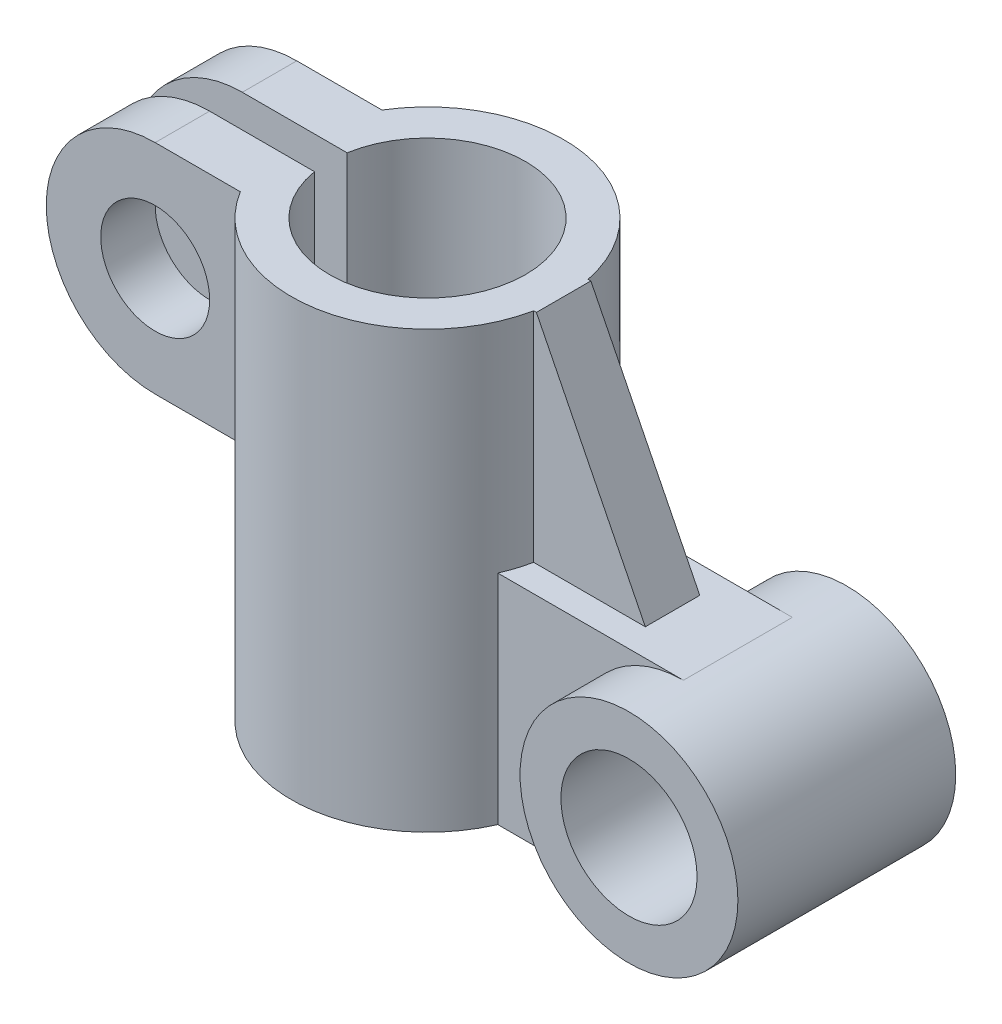
ISO-10303-21;
HEADER;
FILE_DESCRIPTION(('STEP AP214'),'2;1');
FILE_NAME('part.step','',(''),(''),'','','');
FILE_SCHEMA(('AUTOMOTIVE_DESIGN { 1 0 10303 214 1 1 1 1 }'));
ENDSEC;
DATA;
#1=APPLICATION_CONTEXT('core data for automotive mechanical design processes');
#2=APPLICATION_PROTOCOL_DEFINITION('international standard','automotive_design',2000,#1);
#3=PRODUCT_CONTEXT('',#1,'mechanical');
#4=PRODUCT('Part','Part','',(#3));
#5=PRODUCT_RELATED_PRODUCT_CATEGORY('part','',(#4));
#6=PRODUCT_DEFINITION_FORMATION('','',#4);
#7=PRODUCT_DEFINITION_CONTEXT('part definition',#1,'design');
#8=PRODUCT_DEFINITION('design','',#6,#7);
#9=PRODUCT_DEFINITION_SHAPE('','',#8);
#10=(LENGTH_UNIT() NAMED_UNIT(*) SI_UNIT(.MILLI.,.METRE.));
#11=(NAMED_UNIT(*) PLANE_ANGLE_UNIT() SI_UNIT($,.RADIAN.));
#12=(NAMED_UNIT(*) SI_UNIT($,.STERADIAN.) SOLID_ANGLE_UNIT());
#13=UNCERTAINTY_MEASURE_WITH_UNIT(LENGTH_MEASURE(1.E-05),#10,'distance_accuracy_value','');
#14=(GEOMETRIC_REPRESENTATION_CONTEXT(3) GLOBAL_UNCERTAINTY_ASSIGNED_CONTEXT((#13)) GLOBAL_UNIT_ASSIGNED_CONTEXT((#10,
#11,#12)) REPRESENTATION_CONTEXT('',''));
#15=CARTESIAN_POINT('',(0.,0.,0.));
#16=DIRECTION('',(0.,0.,1.));
#17=DIRECTION('',(1.,0.,0.));
#18=AXIS2_PLACEMENT_3D('',#15,#16,#17);
#19=CARTESIAN_POINT('',(0.,80.,0.));
#20=DIRECTION('',(0.,-1.,0.));
#21=DIRECTION('',(0.,0.,-1.));
#22=AXIS2_PLACEMENT_3D('',#19,#20,#21);
#23=CYLINDRICAL_SURFACE('',#22,25.);
#24=CARTESIAN_POINT('',(0.,40.,0.));
#25=DIRECTION('',(0.,1.,0.));
#26=DIRECTION('',(-1.,0.,0.));
#27=AXIS2_PLACEMENT_3D('',#24,#25,#26);
#28=CIRCLE('',#27,25.);
#29=CARTESIAN_POINT('',(-21.3541565040619,40.,13.0000000000012));
#30=VERTEX_POINT('',#29);
#31=CARTESIAN_POINT('',(-24.8193472919817,40.,3.));
#32=VERTEX_POINT('',#31);
#33=EDGE_CURVE('E192',#30,#32,#28,.F.);
#34=ORIENTED_EDGE('',*,*,#33,.T.);
#35=DIRECTION('',(0.,-1.,0.));
#36=VECTOR('',#35,1.);
#37=CARTESIAN_POINT('',(-24.8193472919817,80.,3.));
#38=LINE('',#37,#36);
#39=CARTESIAN_POINT('',(-24.8193472919817,0.,3.));
#40=VERTEX_POINT('',#39);
#41=EDGE_CURVE('E227',#32,#40,#38,.T.);
#42=ORIENTED_EDGE('',*,*,#41,.T.);
#43=CARTESIAN_POINT('',(0.,0.,0.));
#44=DIRECTION('',(0.,1.,0.));
#45=DIRECTION('',(0.,0.,1.));
#46=AXIS2_PLACEMENT_3D('',#43,#44,#45);
#47=CIRCLE('',#46,25.);
#48=CARTESIAN_POINT('',(22.9128784747792,0.,10.));
#49=VERTEX_POINT('',#48);
#50=EDGE_CURVE('E184',#40,#49,#47,.T.);
#51=ORIENTED_EDGE('',*,*,#50,.T.);
#52=DIRECTION('',(0.,-1.,0.));
#53=VECTOR('',#52,1.);
#54=CARTESIAN_POINT('',(22.9128784747792,80.,10.));
#55=LINE('',#54,#53);
#56=CARTESIAN_POINT('',(22.9128784747755,40.,10.0000000000086));
#57=VERTEX_POINT('',#56);
#58=EDGE_CURVE('E283',#49,#57,#55,.F.);
#59=ORIENTED_EDGE('',*,*,#58,.T.);
#60=CARTESIAN_POINT('',(0.,40.,0.));
#61=DIRECTION('',(0.,-1.,0.));
#62=DIRECTION('',(1.,0.,0.));
#63=AXIS2_PLACEMENT_3D('',#60,#61,#62);
#64=CIRCLE('',#63,25.);
#65=CARTESIAN_POINT('',(24.4948974278318,40.,5.));
#66=VERTEX_POINT('',#65);
#67=EDGE_CURVE('E284',#57,#66,#64,.F.);
#68=ORIENTED_EDGE('',*,*,#67,.T.);
#69=DIRECTION('',(0.,-1.,0.));
#70=VECTOR('',#69,1.);
#71=CARTESIAN_POINT('',(24.4948974278318,80.,5.));
#72=LINE('',#71,#70);
#73=CARTESIAN_POINT('',(24.4948974278318,80.,5.));
#74=VERTEX_POINT('',#73);
#75=EDGE_CURVE('E252',#66,#74,#72,.F.);
#76=ORIENTED_EDGE('',*,*,#75,.T.);
#77=CARTESIAN_POINT('',(0.,80.,0.));
#78=DIRECTION('',(0.,1.,0.));
#79=DIRECTION('',(0.,0.,1.));
#80=AXIS2_PLACEMENT_3D('',#77,#78,#79);
#81=CIRCLE('',#80,25.);
#82=CARTESIAN_POINT('',(-21.3541565040626,80.,13.));
#83=VERTEX_POINT('',#82);
#84=EDGE_CURVE('E11',#83,#74,#81,.T.);
#85=ORIENTED_EDGE('',*,*,#84,.F.);
#86=DIRECTION('',(0.,-1.,0.));
#87=VECTOR('',#86,1.);
#88=CARTESIAN_POINT('',(-21.3541565040626,80.,13.));
#89=LINE('',#88,#87);
#90=EDGE_CURVE('E315',#83,#30,#89,.T.);
#91=ORIENTED_EDGE('',*,*,#90,.T.);
#92=EDGE_LOOP('',(#34,#42,#51,#59,#68,#76,#85,#91));
#93=FACE_BOUND('',#92,.T.);
#94=ADVANCED_FACE('F35',(#93),#23,.T.);
#95=CARTESIAN_POINT('',(500000.,40.0000000000434,13.));
#96=DIRECTION('',(0.,1.,0.));
#97=DIRECTION('',(-1.,0.,0.));
#98=AXIS2_PLACEMENT_3D('',#95,#96,#97);
#99=PLANE('',#98);
#100=DIRECTION('',(0.,0.,-1.));
#101=VECTOR('',#100,1.);
#102=CARTESIAN_POINT('',(-37.,40.,13.));
#103=LINE('',#102,#101);
#104=CARTESIAN_POINT('',(-37.,40.,13.));
#105=VERTEX_POINT('',#104);
#106=CARTESIAN_POINT('',(-37.,40.,3.00000000000001));
#107=VERTEX_POINT('',#106);
#108=EDGE_CURVE('E312',#105,#107,#103,.T.);
#109=ORIENTED_EDGE('',*,*,#108,.T.);
#110=DIRECTION('',(1.,0.,0.));
#111=VECTOR('',#110,1.);
#112=CARTESIAN_POINT('',(500000.,40.0000000000434,2.99999999993558));
#113=LINE('',#112,#111);
#114=EDGE_CURVE('E52',#107,#32,#113,.T.);
#115=ORIENTED_EDGE('',*,*,#114,.T.);
#116=ORIENTED_EDGE('',*,*,#33,.F.);
#117=DIRECTION('',(-1.,0.,0.));
#118=VECTOR('',#117,1.);
#119=CARTESIAN_POINT('',(500000.,40.0000000000434,13.));
#120=LINE('',#119,#118);
#121=EDGE_CURVE('E189',#30,#105,#120,.T.);
#122=ORIENTED_EDGE('',*,*,#121,.T.);
#123=EDGE_LOOP('',(#109,#115,#116,#122));
#124=FACE_BOUND('',#123,.T.);
#125=ADVANCED_FACE('F360',(#124),#99,.F.);
#126=CARTESIAN_POINT('',(-37.,60.,13.));
#127=DIRECTION('',(0.,0.,-1.));
#128=DIRECTION('',(-1.,0.,0.));
#129=AXIS2_PLACEMENT_3D('',#126,#127,#128);
#130=CYLINDRICAL_SURFACE('',#129,20.);
#131=DIRECTION('',(0.,0.,-1.));
#132=VECTOR('',#131,1.);
#133=CARTESIAN_POINT('',(-37.,80.,13.));
#134=LINE('',#133,#132);
#135=CARTESIAN_POINT('',(-37.,80.,13.));
#136=VERTEX_POINT('',#135);
#137=CARTESIAN_POINT('',(-37.,80.,3.00000000000001));
#138=VERTEX_POINT('',#137);
#139=EDGE_CURVE('E308',#136,#138,#134,.T.);
#140=ORIENTED_EDGE('',*,*,#139,.T.);
#141=CARTESIAN_POINT('',(-37.,60.,3.00000000000001));
#142=DIRECTION('',(0.,0.,1.));
#143=DIRECTION('',(1.,0.,0.));
#144=AXIS2_PLACEMENT_3D('',#141,#142,#143);
#145=CIRCLE('',#144,20.);
#146=EDGE_CURVE('E224',#138,#107,#145,.T.);
#147=ORIENTED_EDGE('',*,*,#146,.T.);
#148=ORIENTED_EDGE('',*,*,#108,.F.);
#149=CARTESIAN_POINT('',(-37.,60.,13.));
#150=DIRECTION('',(0.,0.,1.));
#151=DIRECTION('',(1.,0.,0.));
#152=AXIS2_PLACEMENT_3D('',#149,#150,#151);
#153=CIRCLE('',#152,20.);
#154=EDGE_CURVE('E298',#136,#105,#153,.T.);
#155=ORIENTED_EDGE('',*,*,#154,.F.);
#156=EDGE_LOOP('',(#140,#147,#148,#155));
#157=FACE_BOUND('',#156,.T.);
#158=ADVANCED_FACE('F362',(#157),#130,.T.);
#159=CARTESIAN_POINT('',(-37.,60.,-25.));
#160=DIRECTION('',(0.,0.,1.));
#161=DIRECTION('',(1.,0.,0.));
#162=AXIS2_PLACEMENT_3D('',#159,#160,#161);
#163=CYLINDRICAL_SURFACE('',#162,10.);
#164=CARTESIAN_POINT('',(-37.,60.,3.00000000000001));
#165=DIRECTION('',(0.,0.,1.));
#166=DIRECTION('',(1.,0.,0.));
#167=AXIS2_PLACEMENT_3D('',#164,#165,#166);
#168=CIRCLE('',#167,10.);
#169=CARTESIAN_POINT('',(-27.,60.,3.));
#170=VERTEX_POINT('',#169);
#171=EDGE_CURVE('E39',#170,#170,#168,.F.);
#172=ORIENTED_EDGE('',*,*,#171,.T.);
#173=EDGE_LOOP('',(#172));
#174=FACE_BOUND('',#173,.T.);
#175=CARTESIAN_POINT('',(-37.,60.,13.));
#176=DIRECTION('',(0.,0.,1.));
#177=DIRECTION('',(1.,0.,0.));
#178=AXIS2_PLACEMENT_3D('',#175,#176,#177);
#179=CIRCLE('',#178,10.);
#180=CARTESIAN_POINT('',(-27.,60.,13.));
#181=VERTEX_POINT('',#180);
#182=EDGE_CURVE('E200',#181,#181,#179,.T.);
#183=ORIENTED_EDGE('',*,*,#182,.T.);
#184=EDGE_LOOP('',(#183));
#185=FACE_BOUND('',#184,.T.);
#186=ADVANCED_FACE('F400',(#174,#185),#163,.F.);
#187=CARTESIAN_POINT('',(22.9128784747792,0.,-10.));
#188=VERTEX_POINT('',#187);
#189=CARTESIAN_POINT('',(-24.8193472919817,0.,-3.));
#190=VERTEX_POINT('',#189);
#191=EDGE_CURVE('E187',#188,#190,#47,.T.);
#192=ORIENTED_EDGE('',*,*,#191,.T.);
#193=DIRECTION('',(0.,-1.,0.));
#194=VECTOR('',#193,1.);
#195=CARTESIAN_POINT('',(-24.8193472919817,80.,-3.));
#196=LINE('',#195,#194);
#197=CARTESIAN_POINT('',(-24.8193472919817,40.,-3.));
#198=VERTEX_POINT('',#197);
#199=EDGE_CURVE('E169',#190,#198,#196,.F.);
#200=ORIENTED_EDGE('',*,*,#199,.T.);
#201=CARTESIAN_POINT('',(-21.35415650406,40.,-13.));
#202=VERTEX_POINT('',#201);
#203=EDGE_CURVE('E317',#198,#202,#28,.F.);
#204=ORIENTED_EDGE('',*,*,#203,.T.);
#205=DIRECTION('',(0.,-1.,0.));
#206=VECTOR('',#205,1.);
#207=CARTESIAN_POINT('',(-21.3541565040626,80.,-13.));
#208=LINE('',#207,#206);
#209=CARTESIAN_POINT('',(-21.3541565040626,80.,-13.));
#210=VERTEX_POINT('',#209);
#211=EDGE_CURVE('E199',#202,#210,#208,.F.);
#212=ORIENTED_EDGE('',*,*,#211,.T.);
#213=CARTESIAN_POINT('',(24.4948974278318,80.,-5.));
#214=VERTEX_POINT('',#213);
#215=EDGE_CURVE('E44',#214,#210,#81,.T.);
#216=ORIENTED_EDGE('',*,*,#215,.F.);
#217=DIRECTION('',(0.,-1.,0.));
#218=VECTOR('',#217,1.);
#219=CARTESIAN_POINT('',(24.4948974278318,80.,-5.));
#220=LINE('',#219,#218);
#221=CARTESIAN_POINT('',(24.4948974278318,40.,-5.));
#222=VERTEX_POINT('',#221);
#223=EDGE_CURVE('E247',#222,#214,#220,.F.);
#224=ORIENTED_EDGE('',*,*,#223,.F.);
#225=CARTESIAN_POINT('',(22.9128784747559,40.,-10.));
#226=VERTEX_POINT('',#225);
#227=EDGE_CURVE('E288',#222,#226,#64,.F.);
#228=ORIENTED_EDGE('',*,*,#227,.T.);
#229=DIRECTION('',(0.,-1.,0.));
#230=VECTOR('',#229,1.);
#231=CARTESIAN_POINT('',(22.9128784747792,80.,-10.));
#232=LINE('',#231,#230);
#233=EDGE_CURVE('E203',#226,#188,#232,.T.);
#234=ORIENTED_EDGE('',*,*,#233,.T.);
#235=EDGE_LOOP('',(#192,#200,#204,#212,#216,#224,#228,#234));
#236=FACE_BOUND('',#235,.T.);
#237=ADVANCED_FACE('F37',(#236),#23,.T.);
#238=CARTESIAN_POINT('',(0.,80.,0.));
#239=DIRECTION('',(0.,1.,0.));
#240=DIRECTION('',(0.,0.,1.));
#241=AXIS2_PLACEMENT_3D('',#238,#239,#240);
#242=PLANE('',#241);
#243=DIRECTION('',(1.,0.,0.));
#244=VECTOR('',#243,1.);
#245=CARTESIAN_POINT('',(-2.78689670523996,80.,3.));
#246=LINE('',#245,#244);
#247=CARTESIAN_POINT('',(-17.7482393492988,80.,3.));
#248=VERTEX_POINT('',#247);
#249=EDGE_CURVE('E179',#138,#248,#246,.T.);
#250=ORIENTED_EDGE('',*,*,#249,.F.);
#251=ORIENTED_EDGE('',*,*,#139,.F.);
#252=DIRECTION('',(-1.,0.,0.));
#253=VECTOR('',#252,1.);
#254=CARTESIAN_POINT('',(500000.,80.0000000000434,13.));
#255=LINE('',#254,#253);
#256=EDGE_CURVE('E318',#83,#136,#255,.T.);
#257=ORIENTED_EDGE('',*,*,#256,.F.);
#258=ORIENTED_EDGE('',*,*,#84,.T.);
#259=DIRECTION('',(1.,0.,0.));
#260=VECTOR('',#259,1.);
#261=CARTESIAN_POINT('',(10.,80.,5.));
#262=LINE('',#261,#260);
#263=CARTESIAN_POINT('',(25.,80.,5.));
#264=VERTEX_POINT('',#263);
#265=EDGE_CURVE('E232',#264,#74,#262,.F.);
#266=ORIENTED_EDGE('',*,*,#265,.F.);
#267=DIRECTION('',(0.,0.,1.));
#268=VECTOR('',#267,1.);
#269=CARTESIAN_POINT('',(25.,80.,0.));
#270=LINE('',#269,#268);
#271=CARTESIAN_POINT('',(25.,80.,-5.));
#272=VERTEX_POINT('',#271);
#273=EDGE_CURVE('E239',#272,#264,#270,.T.);
#274=ORIENTED_EDGE('',*,*,#273,.F.);
#275=DIRECTION('',(1.,0.,0.));
#276=VECTOR('',#275,1.);
#277=CARTESIAN_POINT('',(10.,80.,-5.));
#278=LINE('',#277,#276);
#279=EDGE_CURVE('E231',#272,#214,#278,.F.);
#280=ORIENTED_EDGE('',*,*,#279,.T.);
#281=ORIENTED_EDGE('',*,*,#215,.T.);
#282=DIRECTION('',(-1.,0.,0.));
#283=VECTOR('',#282,1.);
#284=CARTESIAN_POINT('',(0.,80.,-13.));
#285=LINE('',#284,#283);
#286=CARTESIAN_POINT('',(-37.,80.,-13.));
#287=VERTEX_POINT('',#286);
#288=EDGE_CURVE('E301',#210,#287,#285,.T.);
#289=ORIENTED_EDGE('',*,*,#288,.T.);
#290=CARTESIAN_POINT('',(-37.,80.,-2.99999999999998));
#291=VERTEX_POINT('',#290);
#292=EDGE_CURVE('E178',#291,#287,#134,.T.);
#293=ORIENTED_EDGE('',*,*,#292,.F.);
#294=DIRECTION('',(-1.,0.,0.));
#295=VECTOR('',#294,1.);
#296=CARTESIAN_POINT('',(-2.78689670523996,80.,-3.));
#297=LINE('',#296,#295);
#298=CARTESIAN_POINT('',(-17.7482393492988,80.,-3.));
#299=VERTEX_POINT('',#298);
#300=EDGE_CURVE('E60',#299,#291,#297,.T.);
#301=ORIENTED_EDGE('',*,*,#300,.F.);
#302=CARTESIAN_POINT('',(0.,80.,0.));
#303=DIRECTION('',(0.,1.,0.));
#304=DIRECTION('',(0.,0.,1.));
#305=AXIS2_PLACEMENT_3D('',#302,#303,#304);
#306=CIRCLE('',#305,18.);
#307=EDGE_CURVE('E176',#248,#299,#306,.T.);
#308=ORIENTED_EDGE('',*,*,#307,.F.);
#309=EDGE_LOOP('',(#250,#251,#257,#258,#266,#274,#280,#281,#289,#293,#301,#308));
#310=FACE_BOUND('',#309,.T.);
#311=ADVANCED_FACE('F175',(#310),#242,.T.);
#312=CARTESIAN_POINT('',(0.,0.,0.));
#313=DIRECTION('',(0.,1.,0.));
#314=DIRECTION('',(0.,0.,1.));
#315=AXIS2_PLACEMENT_3D('',#312,#313,#314);
#316=PLANE('',#315);
#317=ORIENTED_EDGE('',*,*,#50,.F.);
#318=DIRECTION('',(1.,0.,0.));
#319=VECTOR('',#318,1.);
#320=CARTESIAN_POINT('',(-2.78689670523996,0.,3.));
#321=LINE('',#320,#319);
#322=CARTESIAN_POINT('',(-17.7482393492988,0.,3.));
#323=VERTEX_POINT('',#322);
#324=EDGE_CURVE('E208',#40,#323,#321,.T.);
#325=ORIENTED_EDGE('',*,*,#324,.T.);
#326=CARTESIAN_POINT('',(0.,0.,0.));
#327=DIRECTION('',(0.,1.,0.));
#328=DIRECTION('',(0.,0.,1.));
#329=AXIS2_PLACEMENT_3D('',#326,#327,#328);
#330=CIRCLE('',#329,18.);
#331=CARTESIAN_POINT('',(-17.7482393492988,0.,-3.));
#332=VERTEX_POINT('',#331);
#333=EDGE_CURVE('E185',#323,#332,#330,.T.);
#334=ORIENTED_EDGE('',*,*,#333,.T.);
#335=DIRECTION('',(-1.,0.,0.));
#336=VECTOR('',#335,1.);
#337=CARTESIAN_POINT('',(-2.78689670523996,0.,-3.));
#338=LINE('',#337,#336);
#339=EDGE_CURVE('E164',#332,#190,#338,.T.);
#340=ORIENTED_EDGE('',*,*,#339,.T.);
#341=ORIENTED_EDGE('',*,*,#191,.F.);
#342=DIRECTION('',(1.,0.,0.));
#343=VECTOR('',#342,1.);
#344=CARTESIAN_POINT('',(0.,0.,-10.));
#345=LINE('',#344,#343);
#346=CARTESIAN_POINT('',(57.,0.,-10.));
#347=VERTEX_POINT('',#346);
#348=EDGE_CURVE('E271',#188,#347,#345,.T.);
#349=ORIENTED_EDGE('',*,*,#348,.T.);
#350=DIRECTION('',(0.,0.,-1.));
#351=VECTOR('',#350,1.);
#352=CARTESIAN_POINT('',(57.,0.,10.));
#353=LINE('',#352,#351);
#354=CARTESIAN_POINT('',(57.,0.,10.));
#355=VERTEX_POINT('',#354);
#356=EDGE_CURVE('E270',#355,#347,#353,.T.);
#357=ORIENTED_EDGE('',*,*,#356,.F.);
#358=DIRECTION('',(1.,0.,0.));
#359=VECTOR('',#358,1.);
#360=CARTESIAN_POINT('',(-500000.,-8.67405106075303E-11,10.));
#361=LINE('',#360,#359);
#362=EDGE_CURVE('E287',#49,#355,#361,.T.);
#363=ORIENTED_EDGE('',*,*,#362,.F.);
#364=EDGE_LOOP('',(#317,#325,#334,#340,#341,#349,#357,#363));
#365=FACE_BOUND('',#364,.T.);
#366=ADVANCED_FACE('F367',(#365),#316,.F.);
#367=CARTESIAN_POINT('',(0.,80.,0.));
#368=DIRECTION('',(0.,-1.,0.));
#369=DIRECTION('',(0.,0.,-1.));
#370=AXIS2_PLACEMENT_3D('',#367,#368,#369);
#371=CYLINDRICAL_SURFACE('',#370,18.);
#372=DIRECTION('',(0.,-1.,0.));
#373=VECTOR('',#372,1.);
#374=CARTESIAN_POINT('',(-17.7482393492988,80.,3.));
#375=LINE('',#374,#373);
#376=EDGE_CURVE('E183',#248,#323,#375,.T.);
#377=ORIENTED_EDGE('',*,*,#376,.F.);
#378=ORIENTED_EDGE('',*,*,#307,.T.);
#379=DIRECTION('',(0.,-1.,0.));
#380=VECTOR('',#379,1.);
#381=CARTESIAN_POINT('',(-17.7482393492988,80.,-3.));
#382=LINE('',#381,#380);
#383=EDGE_CURVE('E160',#332,#299,#382,.F.);
#384=ORIENTED_EDGE('',*,*,#383,.F.);
#385=ORIENTED_EDGE('',*,*,#333,.F.);
#386=EDGE_LOOP('',(#377,#378,#384,#385));
#387=FACE_BOUND('',#386,.T.);
#388=ADVANCED_FACE('F182',(#387),#371,.F.);
#389=CARTESIAN_POINT('',(500000.,80.0000000000434,13.));
#390=DIRECTION('',(0.,0.,-1.));
#391=DIRECTION('',(-1.,0.,0.));
#392=AXIS2_PLACEMENT_3D('',#389,#390,#391);
#393=PLANE('',#392);
#394=ORIENTED_EDGE('',*,*,#182,.F.);
#395=EDGE_LOOP('',(#394));
#396=FACE_BOUND('',#395,.T.);
#397=ORIENTED_EDGE('',*,*,#90,.F.);
#398=ORIENTED_EDGE('',*,*,#256,.T.);
#399=ORIENTED_EDGE('',*,*,#154,.T.);
#400=ORIENTED_EDGE('',*,*,#121,.F.);
#401=EDGE_LOOP('',(#397,#398,#399,#400));
#402=FACE_BOUND('',#401,.T.);
#403=ADVANCED_FACE('F356',(#396,#402),#393,.F.);
#404=ORIENTED_EDGE('',*,*,#203,.F.);
#405=DIRECTION('',(-1.,0.,0.));
#406=VECTOR('',#405,1.);
#407=CARTESIAN_POINT('',(500000.,40.0000000000434,-3.0000000000612));
#408=LINE('',#407,#406);
#409=CARTESIAN_POINT('',(-37.,40.,-3.));
#410=VERTEX_POINT('',#409);
#411=EDGE_CURVE('E211',#198,#410,#408,.T.);
#412=ORIENTED_EDGE('',*,*,#411,.T.);
#413=CARTESIAN_POINT('',(-37.,40.,-13.));
#414=VERTEX_POINT('',#413);
#415=EDGE_CURVE('E311',#410,#414,#103,.T.);
#416=ORIENTED_EDGE('',*,*,#415,.T.);
#417=DIRECTION('',(-1.,0.,0.));
#418=VECTOR('',#417,1.);
#419=CARTESIAN_POINT('',(0.,40.,-13.));
#420=LINE('',#419,#418);
#421=EDGE_CURVE('E304',#202,#414,#420,.T.);
#422=ORIENTED_EDGE('',*,*,#421,.F.);
#423=EDGE_LOOP('',(#404,#412,#416,#422));
#424=FACE_BOUND('',#423,.T.);
#425=ADVANCED_FACE('F331',(#424),#99,.F.);
#426=ORIENTED_EDGE('',*,*,#415,.F.);
#427=CARTESIAN_POINT('',(-37.,60.,-3.));
#428=DIRECTION('',(0.,0.,-1.));
#429=DIRECTION('',(-1.,0.,0.));
#430=AXIS2_PLACEMENT_3D('',#427,#428,#429);
#431=CIRCLE('',#430,20.);
#432=EDGE_CURVE('E207',#410,#291,#431,.T.);
#433=ORIENTED_EDGE('',*,*,#432,.T.);
#434=ORIENTED_EDGE('',*,*,#292,.T.);
#435=CARTESIAN_POINT('',(-37.,60.,-13.));
#436=DIRECTION('',(0.,0.,1.));
#437=DIRECTION('',(1.,0.,0.));
#438=AXIS2_PLACEMENT_3D('',#435,#436,#437);
#439=CIRCLE('',#438,20.);
#440=EDGE_CURVE('E297',#287,#414,#439,.T.);
#441=ORIENTED_EDGE('',*,*,#440,.T.);
#442=EDGE_LOOP('',(#426,#433,#434,#441));
#443=FACE_BOUND('',#442,.T.);
#444=ADVANCED_FACE('F412',(#443),#130,.T.);
#445=CARTESIAN_POINT('',(0.,0.,-13.));
#446=DIRECTION('',(0.,0.,1.));
#447=DIRECTION('',(1.,0.,0.));
#448=AXIS2_PLACEMENT_3D('',#445,#446,#447);
#449=PLANE('',#448);
#450=CARTESIAN_POINT('',(-37.,60.,-13.));
#451=DIRECTION('',(0.,0.,1.));
#452=DIRECTION('',(1.,0.,0.));
#453=AXIS2_PLACEMENT_3D('',#450,#451,#452);
#454=CIRCLE('',#453,10.);
#455=CARTESIAN_POINT('',(-27.,60.,-13.));
#456=VERTEX_POINT('',#455);
#457=EDGE_CURVE('E196',#456,#456,#454,.T.);
#458=ORIENTED_EDGE('',*,*,#457,.T.);
#459=EDGE_LOOP('',(#458));
#460=FACE_BOUND('',#459,.T.);
#461=ORIENTED_EDGE('',*,*,#440,.F.);
#462=ORIENTED_EDGE('',*,*,#288,.F.);
#463=ORIENTED_EDGE('',*,*,#211,.F.);
#464=ORIENTED_EDGE('',*,*,#421,.T.);
#465=EDGE_LOOP('',(#461,#462,#463,#464));
#466=FACE_BOUND('',#465,.T.);
#467=ADVANCED_FACE('F336',(#460,#466),#449,.F.);
#468=CARTESIAN_POINT('',(-37.,60.,-3.));
#469=DIRECTION('',(0.,0.,-1.));
#470=DIRECTION('',(-1.,0.,0.));
#471=AXIS2_PLACEMENT_3D('',#468,#469,#470);
#472=CIRCLE('',#471,10.);
#473=CARTESIAN_POINT('',(-47.,60.,-2.99999999999999));
#474=VERTEX_POINT('',#473);
#475=EDGE_CURVE('E205',#474,#474,#472,.F.);
#476=ORIENTED_EDGE('',*,*,#475,.T.);
#477=EDGE_LOOP('',(#476));
#478=FACE_BOUND('',#477,.T.);
#479=ORIENTED_EDGE('',*,*,#457,.F.);
#480=EDGE_LOOP('',(#479));
#481=FACE_BOUND('',#480,.T.);
#482=ADVANCED_FACE('F391',(#478,#481),#163,.F.);
#483=CARTESIAN_POINT('',(-500000.,-8.67405106075303E-11,10.));
#484=DIRECTION('',(0.,0.,-1.));
#485=DIRECTION('',(-1.,0.,0.));
#486=AXIS2_PLACEMENT_3D('',#483,#484,#485);
#487=PLANE('',#486);
#488=ORIENTED_EDGE('',*,*,#58,.F.);
#489=ORIENTED_EDGE('',*,*,#362,.T.);
#490=CARTESIAN_POINT('',(57.,20.,10.));
#491=DIRECTION('',(0.,0.,1.));
#492=DIRECTION('',(1.,0.,0.));
#493=AXIS2_PLACEMENT_3D('',#490,#491,#492);
#494=CIRCLE('',#493,20.);
#495=CARTESIAN_POINT('',(57.,40.,10.));
#496=VERTEX_POINT('',#495);
#497=EDGE_CURVE('E267',#496,#355,#494,.T.);
#498=ORIENTED_EDGE('',*,*,#497,.F.);
#499=DIRECTION('',(1.,0.,0.));
#500=VECTOR('',#499,1.);
#501=CARTESIAN_POINT('',(-500000.,39.9999999999132,10.));
#502=LINE('',#501,#500);
#503=EDGE_CURVE('E289',#57,#496,#502,.T.);
#504=ORIENTED_EDGE('',*,*,#503,.F.);
#505=EDGE_LOOP('',(#488,#489,#498,#504));
#506=FACE_BOUND('',#505,.T.);
#507=ADVANCED_FACE('F371',(#506),#487,.F.);
#508=CARTESIAN_POINT('',(-500000.,39.9999999999132,10.));
#509=DIRECTION('',(0.,-1.,0.));
#510=DIRECTION('',(1.,0.,0.));
#511=AXIS2_PLACEMENT_3D('',#508,#509,#510);
#512=PLANE('',#511);
#513=DIRECTION('',(0.,0.,1.));
#514=VECTOR('',#513,1.);
#515=CARTESIAN_POINT('',(44.9999999999591,40.,10.));
#516=LINE('',#515,#514);
#517=CARTESIAN_POINT('',(45.0000000000048,40.0000000000063,-5.));
#518=VERTEX_POINT('',#517);
#519=CARTESIAN_POINT('',(44.9999999999591,40.,5.));
#520=VERTEX_POINT('',#519);
#521=EDGE_CURVE('E254',#518,#520,#516,.T.);
#522=ORIENTED_EDGE('',*,*,#521,.T.);
#523=DIRECTION('',(-1.,0.,0.));
#524=VECTOR('',#523,1.);
#525=CARTESIAN_POINT('',(-500000.,39.9999999999132,5.));
#526=LINE('',#525,#524);
#527=EDGE_CURVE('E250',#520,#66,#526,.T.);
#528=ORIENTED_EDGE('',*,*,#527,.T.);
#529=ORIENTED_EDGE('',*,*,#67,.F.);
#530=ORIENTED_EDGE('',*,*,#503,.T.);
#531=DIRECTION('',(0.,0.,-1.));
#532=VECTOR('',#531,1.);
#533=CARTESIAN_POINT('',(57.,40.,10.));
#534=LINE('',#533,#532);
#535=CARTESIAN_POINT('',(57.,40.,-10.));
#536=VERTEX_POINT('',#535);
#537=EDGE_CURVE('E280',#496,#536,#534,.T.);
#538=ORIENTED_EDGE('',*,*,#537,.T.);
#539=DIRECTION('',(1.,0.,0.));
#540=VECTOR('',#539,1.);
#541=CARTESIAN_POINT('',(0.,40.,-10.));
#542=LINE('',#541,#540);
#543=EDGE_CURVE('E274',#226,#536,#542,.T.);
#544=ORIENTED_EDGE('',*,*,#543,.F.);
#545=ORIENTED_EDGE('',*,*,#227,.F.);
#546=DIRECTION('',(-1.,0.,0.));
#547=VECTOR('',#546,1.);
#548=CARTESIAN_POINT('',(-500000.,39.9999999999132,-5.));
#549=LINE('',#548,#547);
#550=EDGE_CURVE('E244',#518,#222,#549,.T.);
#551=ORIENTED_EDGE('',*,*,#550,.F.);
#552=EDGE_LOOP('',(#522,#528,#529,#530,#538,#544,#545,#551));
#553=FACE_BOUND('',#552,.T.);
#554=ADVANCED_FACE('F345',(#553),#512,.F.);
#555=CARTESIAN_POINT('',(0.,0.,-10.));
#556=DIRECTION('',(0.,0.,1.));
#557=DIRECTION('',(1.,0.,0.));
#558=AXIS2_PLACEMENT_3D('',#555,#556,#557);
#559=PLANE('',#558);
#560=CARTESIAN_POINT('',(57.,20.,-10.));
#561=DIRECTION('',(0.,0.,1.));
#562=DIRECTION('',(1.,0.,0.));
#563=AXIS2_PLACEMENT_3D('',#560,#561,#562);
#564=CIRCLE('',#563,20.);
#565=EDGE_CURVE('E264',#536,#347,#564,.T.);
#566=ORIENTED_EDGE('',*,*,#565,.T.);
#567=ORIENTED_EDGE('',*,*,#348,.F.);
#568=ORIENTED_EDGE('',*,*,#233,.F.);
#569=ORIENTED_EDGE('',*,*,#543,.T.);
#570=EDGE_LOOP('',(#566,#567,#568,#569));
#571=FACE_BOUND('',#570,.T.);
#572=ADVANCED_FACE('F380',(#571),#559,.F.);
#573=CARTESIAN_POINT('',(57.,20.,20.));
#574=DIRECTION('',(0.,0.,-1.));
#575=DIRECTION('',(-1.,0.,0.));
#576=AXIS2_PLACEMENT_3D('',#573,#574,#575);
#577=CYLINDRICAL_SURFACE('',#576,20.);
#578=ORIENTED_EDGE('',*,*,#356,.T.);
#579=ORIENTED_EDGE('',*,*,#565,.F.);
#580=ORIENTED_EDGE('',*,*,#537,.F.);
#581=ORIENTED_EDGE('',*,*,#497,.T.);
#582=EDGE_LOOP('',(#578,#579,#580,#581));
#583=FACE_BOUND('',#582,.T.);
#584=CARTESIAN_POINT('',(57.,20.,20.));
#585=DIRECTION('',(0.,0.,1.));
#586=DIRECTION('',(1.,0.,0.));
#587=AXIS2_PLACEMENT_3D('',#584,#585,#586);
#588=CIRCLE('',#587,20.);
#589=CARTESIAN_POINT('',(77.,20.,20.));
#590=VERTEX_POINT('',#589);
#591=EDGE_CURVE('E261',#590,#590,#588,.T.);
#592=ORIENTED_EDGE('',*,*,#591,.F.);
#593=EDGE_LOOP('',(#592));
#594=FACE_BOUND('',#593,.T.);
#595=CARTESIAN_POINT('',(57.,20.,-20.));
#596=DIRECTION('',(0.,0.,1.));
#597=DIRECTION('',(1.,0.,0.));
#598=AXIS2_PLACEMENT_3D('',#595,#596,#597);
#599=CIRCLE('',#598,20.);
#600=CARTESIAN_POINT('',(77.,20.,-20.));
#601=VERTEX_POINT('',#600);
#602=EDGE_CURVE('E260',#601,#601,#599,.T.);
#603=ORIENTED_EDGE('',*,*,#602,.T.);
#604=EDGE_LOOP('',(#603));
#605=FACE_BOUND('',#604,.T.);
#606=ADVANCED_FACE('F375',(#583,#594,#605),#577,.T.);
#607=CARTESIAN_POINT('',(0.,0.,20.));
#608=DIRECTION('',(0.,0.,1.));
#609=DIRECTION('',(1.,0.,0.));
#610=AXIS2_PLACEMENT_3D('',#607,#608,#609);
#611=PLANE('',#610);
#612=CARTESIAN_POINT('',(57.,20.,20.));
#613=DIRECTION('',(0.,0.,1.));
#614=DIRECTION('',(1.,0.,0.));
#615=AXIS2_PLACEMENT_3D('',#612,#613,#614);
#616=CIRCLE('',#615,12.5);
#617=CARTESIAN_POINT('',(69.5,20.,20.));
#618=VERTEX_POINT('',#617);
#619=EDGE_CURVE('E204',#618,#618,#616,.T.);
#620=ORIENTED_EDGE('',*,*,#619,.F.);
#621=EDGE_LOOP('',(#620));
#622=FACE_BOUND('',#621,.T.);
#623=ORIENTED_EDGE('',*,*,#591,.T.);
#624=EDGE_LOOP('',(#623));
#625=FACE_BOUND('',#624,.T.);
#626=ADVANCED_FACE('F388',(#622,#625),#611,.T.);
#627=CARTESIAN_POINT('',(0.,0.,-20.));
#628=DIRECTION('',(0.,0.,1.));
#629=DIRECTION('',(1.,0.,0.));
#630=AXIS2_PLACEMENT_3D('',#627,#628,#629);
#631=PLANE('',#630);
#632=CARTESIAN_POINT('',(57.,20.,-20.));
#633=DIRECTION('',(0.,0.,1.));
#634=DIRECTION('',(1.,0.,0.));
#635=AXIS2_PLACEMENT_3D('',#632,#633,#634);
#636=CIRCLE('',#635,12.5);
#637=CARTESIAN_POINT('',(69.5,20.,-20.));
#638=VERTEX_POINT('',#637);
#639=EDGE_CURVE('E201',#638,#638,#636,.T.);
#640=ORIENTED_EDGE('',*,*,#639,.T.);
#641=EDGE_LOOP('',(#640));
#642=FACE_BOUND('',#641,.T.);
#643=ORIENTED_EDGE('',*,*,#602,.F.);
#644=EDGE_LOOP('',(#643));
#645=FACE_BOUND('',#644,.T.);
#646=ADVANCED_FACE('F497',(#642,#645),#631,.F.);
#647=CARTESIAN_POINT('',(57.,20.,-25.));
#648=DIRECTION('',(0.,0.,1.));
#649=DIRECTION('',(1.,0.,0.));
#650=AXIS2_PLACEMENT_3D('',#647,#648,#649);
#651=CYLINDRICAL_SURFACE('',#650,12.5);
#652=CARTESIAN_POINT('',(69.5,20.,20.));
#653=CARTESIAN_POINT('',(69.5,20.,19.5833333333333));
#654=CARTESIAN_POINT('',(69.5,20.,19.1666666666667));
#655=CARTESIAN_POINT('',(69.5,20.,18.3333333333333));
#656=CARTESIAN_POINT('',(69.5,20.,17.9166666666667));
#657=CARTESIAN_POINT('',(69.5,20.,17.0833333333333));
#658=CARTESIAN_POINT('',(69.5,20.,16.6666666666667));
#659=CARTESIAN_POINT('',(69.5,20.,15.8333333333333));
#660=CARTESIAN_POINT('',(69.5,20.,15.4166666666667));
#661=CARTESIAN_POINT('',(69.5,20.,14.5833333333333));
#662=CARTESIAN_POINT('',(69.5,20.,14.1666666666667));
#663=CARTESIAN_POINT('',(69.5,20.,13.3333333333333));
#664=CARTESIAN_POINT('',(69.5,20.,12.9166666666667));
#665=CARTESIAN_POINT('',(69.5,20.,12.0833333333333));
#666=CARTESIAN_POINT('',(69.5,20.,11.6666666666667));
#667=CARTESIAN_POINT('',(69.5,20.,10.8333333333333));
#668=CARTESIAN_POINT('',(69.5,20.,10.4166666666667));
#669=CARTESIAN_POINT('',(69.5,20.,9.58333333333333));
#670=CARTESIAN_POINT('',(69.5,20.,9.16666666666666));
#671=CARTESIAN_POINT('',(69.5,20.,8.33333333333333));
#672=CARTESIAN_POINT('',(69.5,20.,7.91666666666666));
#673=CARTESIAN_POINT('',(69.5,20.,7.08333333333333));
#674=CARTESIAN_POINT('',(69.5,20.,6.66666666666666));
#675=CARTESIAN_POINT('',(69.5,20.,5.83333333333333));
#676=CARTESIAN_POINT('',(69.5,20.,5.41666666666666));
#677=CARTESIAN_POINT('',(69.5,20.,4.58333333333333));
#678=CARTESIAN_POINT('',(69.5,20.,4.16666666666666));
#679=CARTESIAN_POINT('',(69.5,20.,3.33333333333333));
#680=CARTESIAN_POINT('',(69.5,20.,2.91666666666666));
#681=CARTESIAN_POINT('',(69.5,20.,2.08333333333333));
#682=CARTESIAN_POINT('',(69.5,20.,1.66666666666666));
#683=CARTESIAN_POINT('',(69.5,20.,0.83333333333333));
#684=CARTESIAN_POINT('',(69.5,20.,0.416666666666664));
#685=CARTESIAN_POINT('',(69.5,20.,-0.41666666666667));
#686=CARTESIAN_POINT('',(69.5,20.,-0.833333333333337));
#687=CARTESIAN_POINT('',(69.5,20.,-1.66666666666667));
#688=CARTESIAN_POINT('',(69.5,20.,-2.08333333333334));
#689=CARTESIAN_POINT('',(69.5,20.,-2.91666666666667));
#690=CARTESIAN_POINT('',(69.5,20.,-3.33333333333334));
#691=CARTESIAN_POINT('',(69.5,20.,-4.16666666666667));
#692=CARTESIAN_POINT('',(69.5,20.,-4.58333333333334));
#693=CARTESIAN_POINT('',(69.5,20.,-5.41666666666667));
#694=CARTESIAN_POINT('',(69.5,20.,-5.83333333333334));
#695=CARTESIAN_POINT('',(69.5,20.,-6.66666666666667));
#696=CARTESIAN_POINT('',(69.5,20.,-7.08333333333334));
#697=CARTESIAN_POINT('',(69.5,20.,-7.91666666666667));
#698=CARTESIAN_POINT('',(69.5,20.,-8.33333333333334));
#699=CARTESIAN_POINT('',(69.5,20.,-9.16666666666667));
#700=CARTESIAN_POINT('',(69.5,20.,-9.58333333333333));
#701=CARTESIAN_POINT('',(69.5,20.,-10.4166666666667));
#702=CARTESIAN_POINT('',(69.5,20.,-10.8333333333333));
#703=CARTESIAN_POINT('',(69.5,20.,-11.6666666666667));
#704=CARTESIAN_POINT('',(69.5,20.,-12.0833333333333));
#705=CARTESIAN_POINT('',(69.5,20.,-12.9166666666667));
#706=CARTESIAN_POINT('',(69.5,20.,-13.3333333333333));
#707=CARTESIAN_POINT('',(69.5,20.,-14.1666666666667));
#708=CARTESIAN_POINT('',(69.5,20.,-14.5833333333333));
#709=CARTESIAN_POINT('',(69.5,20.,-15.4166666666667));
#710=CARTESIAN_POINT('',(69.5,20.,-15.8333333333333));
#711=CARTESIAN_POINT('',(69.5,20.,-16.6666666666667));
#712=CARTESIAN_POINT('',(69.5,20.,-17.0833333333333));
#713=CARTESIAN_POINT('',(69.5,20.,-17.9166666666667));
#714=CARTESIAN_POINT('',(69.5,20.,-18.3333333333333));
#715=CARTESIAN_POINT('',(69.5,20.,-19.1666666666667));
#716=CARTESIAN_POINT('',(69.5,20.,-19.5833333333333));
#717=CARTESIAN_POINT('',(69.5,20.,-20.));
#718=B_SPLINE_CURVE_WITH_KNOTS('',3,(#652,#653,#654,#655,#656,#657,#658,#659,#660,#661,#662,
#663,#664,#665,#666,#667,#668,#669,#670,#671,#672,#673,#674,#675,#676,#677,#678,#679,#680,#681,
#682,#683,#684,#685,#686,#687,#688,#689,#690,#691,#692,#693,#694,#695,#696,#697,#698,#699,#700,
#701,#702,#703,#704,#705,#706,#707,#708,#709,#710,#711,#712,#713,#714,#715,#716,#717),
.UNSPECIFIED.,.F.,.F.,(4,2,2,2,2,2,2,2,2,2,2,2,2,2,2,2,2,2,2,2,2,2,2,2,2,2,2,2,2,2,2,2,4),(0.,
1.25,2.5,3.75,5.,6.25,7.5,8.75,10.,11.25,12.5,13.75,15.,16.25,17.5,18.75,20.,21.25,22.5,23.75,
25.,26.25,27.5,28.75,30.,31.25,32.5,33.75,35.,36.25,37.5,38.75,40.),.UNSPECIFIED.);
#719=EDGE_CURVE('BSEAM494',#618,#638,#718,.T.);
#720=ORIENTED_EDGE('',*,*,#619,.T.);
#721=ORIENTED_EDGE('',*,*,#639,.F.);
#722=ORIENTED_EDGE('',*,*,#719,.T.);
#723=ORIENTED_EDGE('',*,*,#719,.F.);
#724=EDGE_LOOP('',(#720,#722,#721,#723));
#725=FACE_BOUND('',#724,.T.);
#726=ADVANCED_FACE('F494',(#725),#651,.F.);
#727=CARTESIAN_POINT('',(25.,80.,0.));
#728=DIRECTION('',(0.894427190999916,0.447213595499958,0.));
#729=DIRECTION('',(-0.447213595499958,0.894427190999916,0.));
#730=AXIS2_PLACEMENT_3D('',#727,#728,#729);
#731=PLANE('',#730);
#732=ORIENTED_EDGE('',*,*,#521,.F.);
#733=DIRECTION('',(-0.447213595499958,0.894427190999916,0.));
#734=VECTOR('',#733,1.);
#735=CARTESIAN_POINT('',(25.,80.,-5.));
#736=LINE('',#735,#734);
#737=EDGE_CURVE('E236',#518,#272,#736,.T.);
#738=ORIENTED_EDGE('',*,*,#737,.T.);
#739=ORIENTED_EDGE('',*,*,#273,.T.);
#740=DIRECTION('',(-0.447213595499958,0.894427190999916,0.));
#741=VECTOR('',#740,1.);
#742=CARTESIAN_POINT('',(25.,80.,5.));
#743=LINE('',#742,#741);
#744=EDGE_CURVE('E235',#520,#264,#743,.T.);
#745=ORIENTED_EDGE('',*,*,#744,.F.);
#746=EDGE_LOOP('',(#732,#738,#739,#745));
#747=FACE_BOUND('',#746,.T.);
#748=ADVANCED_FACE('F350',(#747),#731,.T.);
#749=CARTESIAN_POINT('',(10.,40.,5.));
#750=DIRECTION('',(0.,0.,1.));
#751=DIRECTION('',(1.,0.,0.));
#752=AXIS2_PLACEMENT_3D('',#749,#750,#751);
#753=PLANE('',#752);
#754=ORIENTED_EDGE('',*,*,#75,.F.);
#755=ORIENTED_EDGE('',*,*,#527,.F.);
#756=ORIENTED_EDGE('',*,*,#744,.T.);
#757=ORIENTED_EDGE('',*,*,#265,.T.);
#758=EDGE_LOOP('',(#754,#755,#756,#757));
#759=FACE_BOUND('',#758,.T.);
#760=ADVANCED_FACE('F354',(#759),#753,.T.);
#761=CARTESIAN_POINT('',(10.,40.,-5.));
#762=DIRECTION('',(0.,0.,1.));
#763=DIRECTION('',(1.,0.,0.));
#764=AXIS2_PLACEMENT_3D('',#761,#762,#763);
#765=PLANE('',#764);
#766=ORIENTED_EDGE('',*,*,#550,.T.);
#767=ORIENTED_EDGE('',*,*,#223,.T.);
#768=ORIENTED_EDGE('',*,*,#279,.F.);
#769=ORIENTED_EDGE('',*,*,#737,.F.);
#770=EDGE_LOOP('',(#766,#767,#768,#769));
#771=FACE_BOUND('',#770,.T.);
#772=ADVANCED_FACE('F341',(#771),#765,.F.);
#773=CARTESIAN_POINT('',(-2.78689670523996,0.,-3.));
#774=DIRECTION('',(0.,0.,-1.));
#775=DIRECTION('',(-1.,0.,0.));
#776=AXIS2_PLACEMENT_3D('',#773,#774,#775);
#777=PLANE('',#776);
#778=ORIENTED_EDGE('',*,*,#383,.T.);
#779=ORIENTED_EDGE('',*,*,#300,.T.);
#780=ORIENTED_EDGE('',*,*,#432,.F.);
#781=ORIENTED_EDGE('',*,*,#411,.F.);
#782=ORIENTED_EDGE('',*,*,#199,.F.);
#783=ORIENTED_EDGE('',*,*,#339,.F.);
#784=EDGE_LOOP('',(#778,#779,#780,#781,#782,#783));
#785=FACE_BOUND('',#784,.T.);
#786=ORIENTED_EDGE('',*,*,#475,.F.);
#787=EDGE_LOOP('',(#786));
#788=FACE_BOUND('',#787,.T.);
#789=ADVANCED_FACE('F161',(#785,#788),#777,.F.);
#790=CARTESIAN_POINT('',(-2.78689670523996,0.,3.));
#791=DIRECTION('',(0.,0.,1.));
#792=DIRECTION('',(1.,0.,0.));
#793=AXIS2_PLACEMENT_3D('',#790,#791,#792);
#794=PLANE('',#793);
#795=ORIENTED_EDGE('',*,*,#376,.T.);
#796=ORIENTED_EDGE('',*,*,#324,.F.);
#797=ORIENTED_EDGE('',*,*,#41,.F.);
#798=ORIENTED_EDGE('',*,*,#114,.F.);
#799=ORIENTED_EDGE('',*,*,#146,.F.);
#800=ORIENTED_EDGE('',*,*,#249,.T.);
#801=EDGE_LOOP('',(#795,#796,#797,#798,#799,#800));
#802=FACE_BOUND('',#801,.T.);
#803=ORIENTED_EDGE('',*,*,#171,.F.);
#804=EDGE_LOOP('',(#803));
#805=FACE_BOUND('',#804,.T.);
#806=ADVANCED_FACE('F363',(#802,#805),#794,.F.);
#807=CLOSED_SHELL('',(#94,#125,#158,#186,#237,#311,#366,#388,#403,#425,#444,#467,#482,#507,#554,
#572,#606,#626,#646,#726,#748,#760,#772,#789,#806));
#808=MANIFOLD_SOLID_BREP('B2',#807);
#809=ADVANCED_BREP_SHAPE_REPRESENTATION('',(#18,#808),#14);
#810=SHAPE_DEFINITION_REPRESENTATION(#9,#809);
ENDSEC;
END-ISO-10303-21;
